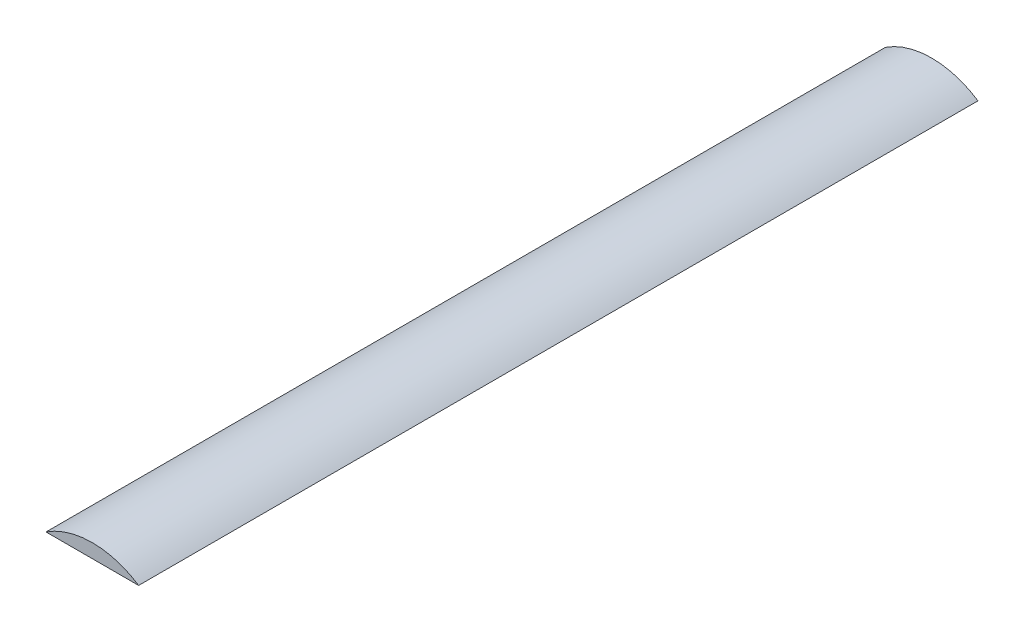
ISO-10303-21;
HEADER;
FILE_DESCRIPTION(('STEP AP214'),'2;1');
FILE_NAME('part.step','',(''),(''),'','','');
FILE_SCHEMA(('AUTOMOTIVE_DESIGN { 1 0 10303 214 1 1 1 1 }'));
ENDSEC;
DATA;
#1=APPLICATION_CONTEXT('core data for automotive mechanical design processes');
#2=APPLICATION_PROTOCOL_DEFINITION('international standard','automotive_design',2000,#1);
#3=PRODUCT_CONTEXT('',#1,'mechanical');
#4=PRODUCT('Part','Part','',(#3));
#5=PRODUCT_RELATED_PRODUCT_CATEGORY('part','',(#4));
#6=PRODUCT_DEFINITION_FORMATION('','',#4);
#7=PRODUCT_DEFINITION_CONTEXT('part definition',#1,'design');
#8=PRODUCT_DEFINITION('design','',#6,#7);
#9=PRODUCT_DEFINITION_SHAPE('','',#8);
#10=(LENGTH_UNIT() NAMED_UNIT(*) SI_UNIT(.MILLI.,.METRE.));
#11=(NAMED_UNIT(*) PLANE_ANGLE_UNIT() SI_UNIT($,.RADIAN.));
#12=(NAMED_UNIT(*) SI_UNIT($,.STERADIAN.) SOLID_ANGLE_UNIT());
#13=UNCERTAINTY_MEASURE_WITH_UNIT(LENGTH_MEASURE(1.E-05),#10,'distance_accuracy_value','');
#14=(GEOMETRIC_REPRESENTATION_CONTEXT(3) GLOBAL_UNCERTAINTY_ASSIGNED_CONTEXT((#13)) GLOBAL_UNIT_ASSIGNED_CONTEXT((#10,
#11,#12)) REPRESENTATION_CONTEXT('',''));
#15=CARTESIAN_POINT('',(0.,0.,0.));
#16=DIRECTION('',(0.,0.,1.));
#17=DIRECTION('',(1.,0.,0.));
#18=AXIS2_PLACEMENT_3D('',#15,#16,#17);
#19=CARTESIAN_POINT('',(0.,0.,10000.));
#20=DIRECTION('',(0.,0.,-1.));
#21=DIRECTION('',(-1.,0.,0.));
#22=AXIS2_PLACEMENT_3D('',#19,#20,#21);
#23=CYLINDRICAL_SURFACE('',#22,1000.);
#24=DIRECTION('',(0.,0.,-1.));
#25=VECTOR('',#24,1.);
#26=CARTESIAN_POINT('',(-551.764442493352,834.,10000.));
#27=LINE('',#26,#25);
#28=CARTESIAN_POINT('',(-551.764442493352,834.,10000.));
#29=VERTEX_POINT('',#28);
#30=CARTESIAN_POINT('',(-551.764442493352,834.,0.));
#31=VERTEX_POINT('',#30);
#32=EDGE_CURVE('E46',#29,#31,#27,.T.);
#33=ORIENTED_EDGE('',*,*,#32,.F.);
#34=CARTESIAN_POINT('',(0.,0.,10000.));
#35=DIRECTION('',(0.,0.,1.));
#36=DIRECTION('',(1.,0.,0.));
#37=AXIS2_PLACEMENT_3D('',#34,#35,#36);
#38=CIRCLE('',#37,1000.);
#39=CARTESIAN_POINT('',(551.764442493352,834.,10000.));
#40=VERTEX_POINT('',#39);
#41=EDGE_CURVE('E40',#40,#29,#38,.T.);
#42=ORIENTED_EDGE('',*,*,#41,.F.);
#43=DIRECTION('',(0.,0.,-1.));
#44=VECTOR('',#43,1.);
#45=CARTESIAN_POINT('',(551.764442493352,834.,10000.));
#46=LINE('',#45,#44);
#47=CARTESIAN_POINT('',(551.764442493352,834.,0.));
#48=VERTEX_POINT('',#47);
#49=EDGE_CURVE('E57',#48,#40,#46,.F.);
#50=ORIENTED_EDGE('',*,*,#49,.F.);
#51=CARTESIAN_POINT('',(0.,0.,0.));
#52=DIRECTION('',(0.,0.,1.));
#53=DIRECTION('',(1.,0.,0.));
#54=AXIS2_PLACEMENT_3D('',#51,#52,#53);
#55=CIRCLE('',#54,1000.);
#56=EDGE_CURVE('E63',#48,#31,#55,.T.);
#57=ORIENTED_EDGE('',*,*,#56,.T.);
#58=EDGE_LOOP('',(#33,#42,#50,#57));
#59=FACE_BOUND('',#58,.T.);
#60=ADVANCED_FACE('F33',(#59),#23,.T.);
#61=CARTESIAN_POINT('',(0.,0.,10000.));
#62=DIRECTION('',(0.,0.,1.));
#63=DIRECTION('',(1.,0.,0.));
#64=AXIS2_PLACEMENT_3D('',#61,#62,#63);
#65=PLANE('',#64);
#66=ORIENTED_EDGE('',*,*,#41,.T.);
#67=DIRECTION('',(1.,0.,0.));
#68=VECTOR('',#67,1.);
#69=CARTESIAN_POINT('',(0.,834.,10000.));
#70=LINE('',#69,#68);
#71=EDGE_CURVE('E51',#29,#40,#70,.T.);
#72=ORIENTED_EDGE('',*,*,#71,.T.);
#73=EDGE_LOOP('',(#66,#72));
#74=FACE_BOUND('',#73,.T.);
#75=ADVANCED_FACE('F71',(#74),#65,.T.);
#76=CARTESIAN_POINT('',(0.,0.,0.));
#77=DIRECTION('',(0.,0.,1.));
#78=DIRECTION('',(1.,0.,0.));
#79=AXIS2_PLACEMENT_3D('',#76,#77,#78);
#80=PLANE('',#79);
#81=DIRECTION('',(1.,0.,0.));
#82=VECTOR('',#81,1.);
#83=CARTESIAN_POINT('',(0.,834.,0.));
#84=LINE('',#83,#82);
#85=EDGE_CURVE('E11',#31,#48,#84,.T.);
#86=ORIENTED_EDGE('',*,*,#85,.F.);
#87=ORIENTED_EDGE('',*,*,#56,.F.);
#88=EDGE_LOOP('',(#86,#87));
#89=FACE_BOUND('',#88,.T.);
#90=ADVANCED_FACE('F66',(#89),#80,.F.);
#91=CARTESIAN_POINT('',(-1291.01998689432,834.,11646.));
#92=DIRECTION('',(0.,-1.,0.));
#93=DIRECTION('',(1.,0.,0.));
#94=AXIS2_PLACEMENT_3D('',#91,#92,#93);
#95=PLANE('',#94);
#96=ORIENTED_EDGE('',*,*,#32,.T.);
#97=ORIENTED_EDGE('',*,*,#85,.T.);
#98=ORIENTED_EDGE('',*,*,#49,.T.);
#99=ORIENTED_EDGE('',*,*,#71,.F.);
#100=EDGE_LOOP('',(#96,#97,#98,#99));
#101=FACE_BOUND('',#100,.T.);
#102=ADVANCED_FACE('F56',(#101),#95,.T.);
#103=CLOSED_SHELL('',(#60,#75,#90,#102));
#104=MANIFOLD_SOLID_BREP('B2',#103);
#105=ADVANCED_BREP_SHAPE_REPRESENTATION('',(#18,#104),#14);
#106=SHAPE_DEFINITION_REPRESENTATION(#9,#105);
ENDSEC;
END-ISO-10303-21;
